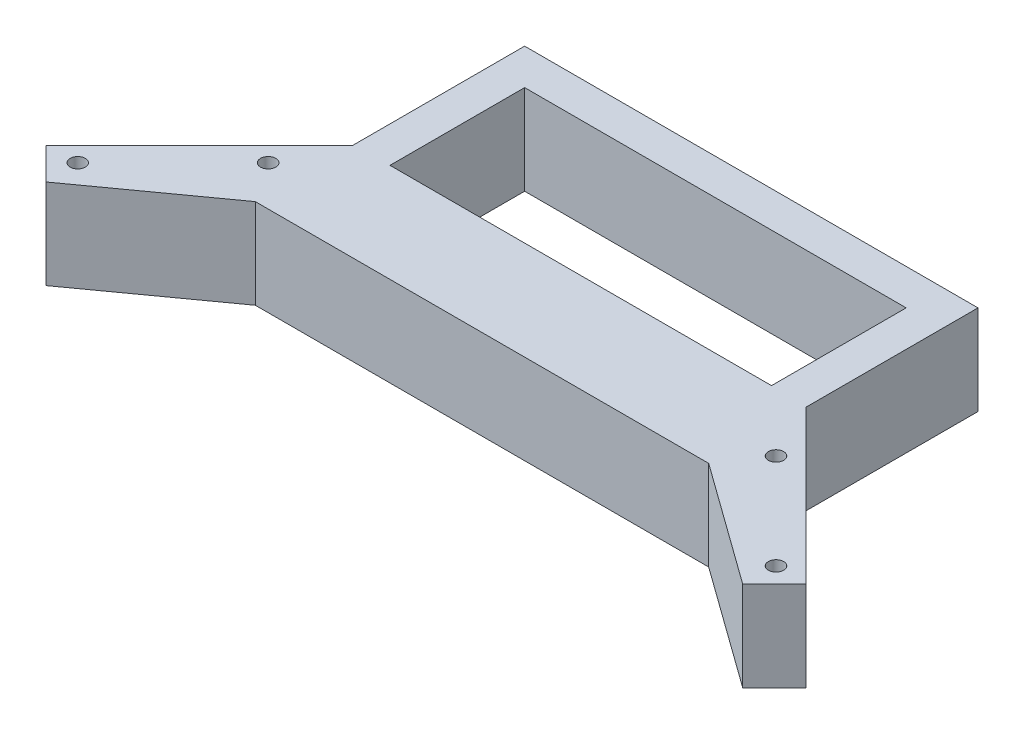
ISO-10303-21;
HEADER;
FILE_DESCRIPTION(('STEP AP214'),'2;1');
FILE_NAME('part.step','',(''),(''),'','','');
FILE_SCHEMA(('AUTOMOTIVE_DESIGN { 1 0 10303 214 1 1 1 1 }'));
ENDSEC;
DATA;
#1=APPLICATION_CONTEXT('core data for automotive mechanical design processes');
#2=APPLICATION_PROTOCOL_DEFINITION('international standard','automotive_design',2000,#1);
#3=PRODUCT_CONTEXT('',#1,'mechanical');
#4=PRODUCT('Part','Part','',(#3));
#5=PRODUCT_RELATED_PRODUCT_CATEGORY('part','',(#4));
#6=PRODUCT_DEFINITION_FORMATION('','',#4);
#7=PRODUCT_DEFINITION_CONTEXT('part definition',#1,'design');
#8=PRODUCT_DEFINITION('design','',#6,#7);
#9=PRODUCT_DEFINITION_SHAPE('','',#8);
#10=(LENGTH_UNIT() NAMED_UNIT(*) SI_UNIT(.MILLI.,.METRE.));
#11=(NAMED_UNIT(*) PLANE_ANGLE_UNIT() SI_UNIT($,.RADIAN.));
#12=(NAMED_UNIT(*) SI_UNIT($,.STERADIAN.) SOLID_ANGLE_UNIT());
#13=UNCERTAINTY_MEASURE_WITH_UNIT(LENGTH_MEASURE(1.E-05),#10,'distance_accuracy_value','');
#14=(GEOMETRIC_REPRESENTATION_CONTEXT(3) GLOBAL_UNCERTAINTY_ASSIGNED_CONTEXT((#13)) GLOBAL_UNIT_ASSIGNED_CONTEXT((#10,
#11,#12)) REPRESENTATION_CONTEXT('',''));
#15=CARTESIAN_POINT('',(0.,0.,0.));
#16=DIRECTION('',(0.,0.,1.));
#17=DIRECTION('',(1.,0.,0.));
#18=AXIS2_PLACEMENT_3D('',#15,#16,#17);
#19=CARTESIAN_POINT('',(-86.7629453922952,25.4,86.7629453922953));
#20=DIRECTION('',(0.707106781186547,0.,-0.707106781186548));
#21=DIRECTION('',(-0.707106781186548,0.,-0.707106781186547));
#22=AXIS2_PLACEMENT_3D('',#19,#20,#21);
#23=PLANE('',#22);
#24=DIRECTION('',(0.707106781186548,0.,0.707106781186547));
#25=VECTOR('',#24,1.);
#26=CARTESIAN_POINT('',(-86.7629453922952,0.,86.7629453922953));
#27=LINE('',#26,#25);
#28=CARTESIAN_POINT('',(-107.547547305924,0.,65.9783434786663));
#29=VERTEX_POINT('',#28);
#30=CARTESIAN_POINT('',(-98.567291184855,0.,74.9585995997355));
#31=VERTEX_POINT('',#30);
#32=EDGE_CURVE('E202',#29,#31,#27,.T.);
#33=ORIENTED_EDGE('',*,*,#32,.T.);
#34=DIRECTION('',(0.,-1.,0.));
#35=VECTOR('',#34,1.);
#36=CARTESIAN_POINT('',(-98.567291184855,25.4,74.9585995997355));
#37=LINE('',#36,#35);
#38=CARTESIAN_POINT('',(-98.567291184855,25.4,74.9585995997355));
#39=VERTEX_POINT('',#38);
#40=EDGE_CURVE('E11',#39,#31,#37,.T.);
#41=ORIENTED_EDGE('',*,*,#40,.F.);
#42=DIRECTION('',(0.707106781186548,0.,0.707106781186547));
#43=VECTOR('',#42,1.);
#44=CARTESIAN_POINT('',(-86.7629453922952,25.4,86.7629453922953));
#45=LINE('',#44,#43);
#46=CARTESIAN_POINT('',(-107.547547305924,25.4,65.9783434786663));
#47=VERTEX_POINT('',#46);
#48=EDGE_CURVE('E367',#47,#39,#45,.T.);
#49=ORIENTED_EDGE('',*,*,#48,.F.);
#50=DIRECTION('',(0.,-1.,0.));
#51=VECTOR('',#50,1.);
#52=CARTESIAN_POINT('',(-107.547547305924,25.4,65.9783434786663));
#53=LINE('',#52,#51);
#54=EDGE_CURVE('E235',#47,#29,#53,.T.);
#55=ORIENTED_EDGE('',*,*,#54,.T.);
#56=EDGE_LOOP('',(#33,#41,#49,#55));
#57=FACE_BOUND('',#56,.T.);
#58=ADVANCED_FACE('F38',(#57),#23,.F.);
#59=CARTESIAN_POINT('',(1.88892959468487,25.4,2.62326466837729));
#60=DIRECTION('',(-0.584341200542991,0.,-0.811508078424347));
#61=DIRECTION('',(-0.811508078424347,0.,0.584341200542991));
#62=AXIS2_PLACEMENT_3D('',#59,#60,#61);
#63=PLANE('',#62);
#64=DIRECTION('',(0.811508078424347,0.,-0.584341200542991));
#65=VECTOR('',#64,1.);
#66=CARTESIAN_POINT('',(1.88892959468487,0.,2.62326466837729));
#67=LINE('',#66,#65);
#68=CARTESIAN_POINT('',(-64.135,0.,50.165));
#69=VERTEX_POINT('',#68);
#70=EDGE_CURVE('E205',#31,#69,#67,.T.);
#71=ORIENTED_EDGE('',*,*,#70,.T.);
#72=DIRECTION('',(0.,-1.,0.));
#73=VECTOR('',#72,1.);
#74=CARTESIAN_POINT('',(-64.135,25.4,50.165));
#75=LINE('',#74,#73);
#76=CARTESIAN_POINT('',(-64.135,25.4,50.165));
#77=VERTEX_POINT('',#76);
#78=EDGE_CURVE('E48',#77,#69,#75,.T.);
#79=ORIENTED_EDGE('',*,*,#78,.F.);
#80=DIRECTION('',(0.811508078424347,0.,-0.584341200542991));
#81=VECTOR('',#80,1.);
#82=CARTESIAN_POINT('',(1.88892959468487,25.4,2.62326466837729));
#83=LINE('',#82,#81);
#84=EDGE_CURVE('E359',#39,#77,#83,.T.);
#85=ORIENTED_EDGE('',*,*,#84,.F.);
#86=ORIENTED_EDGE('',*,*,#40,.T.);
#87=EDGE_LOOP('',(#71,#79,#85,#86));
#88=FACE_BOUND('',#87,.T.);
#89=ADVANCED_FACE('F283',(#88),#63,.F.);
#90=CARTESIAN_POINT('',(0.,25.4,50.165));
#91=DIRECTION('',(0.,0.,-1.));
#92=DIRECTION('',(-1.,0.,0.));
#93=AXIS2_PLACEMENT_3D('',#90,#91,#92);
#94=PLANE('',#93);
#95=DIRECTION('',(1.,0.,0.));
#96=VECTOR('',#95,1.);
#97=CARTESIAN_POINT('',(0.,0.,50.165));
#98=LINE('',#97,#96);
#99=CARTESIAN_POINT('',(64.135,0.,50.165));
#100=VERTEX_POINT('',#99);
#101=EDGE_CURVE('E207',#69,#100,#98,.T.);
#102=ORIENTED_EDGE('',*,*,#101,.T.);
#103=DIRECTION('',(0.,-1.,0.));
#104=VECTOR('',#103,1.);
#105=CARTESIAN_POINT('',(64.135,25.4,50.165));
#106=LINE('',#105,#104);
#107=CARTESIAN_POINT('',(64.135,25.4,50.165));
#108=VERTEX_POINT('',#107);
#109=EDGE_CURVE('E245',#108,#100,#106,.T.);
#110=ORIENTED_EDGE('',*,*,#109,.F.);
#111=DIRECTION('',(1.,0.,0.));
#112=VECTOR('',#111,1.);
#113=CARTESIAN_POINT('',(0.,25.4,50.165));
#114=LINE('',#113,#112);
#115=EDGE_CURVE('E356',#77,#108,#114,.T.);
#116=ORIENTED_EDGE('',*,*,#115,.F.);
#117=ORIENTED_EDGE('',*,*,#78,.T.);
#118=EDGE_LOOP('',(#102,#110,#116,#117));
#119=FACE_BOUND('',#118,.T.);
#120=ADVANCED_FACE('F289',(#119),#94,.F.);
#121=CARTESIAN_POINT('',(-1.88892959468489,25.4,2.62326466837733));
#122=DIRECTION('',(-0.58434120054299,0.,0.811508078424347));
#123=DIRECTION('',(0.811508078424348,0.,0.58434120054299));
#124=AXIS2_PLACEMENT_3D('',#121,#122,#123);
#125=PLANE('',#124);
#126=DIRECTION('',(-0.811508078424347,0.,-0.58434120054299));
#127=VECTOR('',#126,1.);
#128=CARTESIAN_POINT('',(-1.88892959468489,0.,2.62326466837733));
#129=LINE('',#128,#127);
#130=CARTESIAN_POINT('',(98.567291184855,0.,74.9585995997355));
#131=VERTEX_POINT('',#130);
#132=EDGE_CURVE('E210',#131,#100,#129,.T.);
#133=ORIENTED_EDGE('',*,*,#132,.F.);
#134=DIRECTION('',(0.,-1.,0.));
#135=VECTOR('',#134,1.);
#136=CARTESIAN_POINT('',(98.567291184855,25.4,74.9585995997355));
#137=LINE('',#136,#135);
#138=CARTESIAN_POINT('',(98.567291184855,25.4,74.9585995997355));
#139=VERTEX_POINT('',#138);
#140=EDGE_CURVE('E243',#139,#131,#137,.T.);
#141=ORIENTED_EDGE('',*,*,#140,.F.);
#142=DIRECTION('',(-0.811508078424347,0.,-0.58434120054299));
#143=VECTOR('',#142,1.);
#144=CARTESIAN_POINT('',(-1.88892959468489,25.4,2.62326466837733));
#145=LINE('',#144,#143);
#146=EDGE_CURVE('E352',#139,#108,#145,.T.);
#147=ORIENTED_EDGE('',*,*,#146,.T.);
#148=ORIENTED_EDGE('',*,*,#109,.T.);
#149=EDGE_LOOP('',(#133,#141,#147,#148));
#150=FACE_BOUND('',#149,.T.);
#151=ADVANCED_FACE('F333',(#150),#125,.T.);
#152=CARTESIAN_POINT('',(86.7629453922954,25.4,86.7629453922952));
#153=DIRECTION('',(0.707106781186548,0.,0.707106781186546));
#154=DIRECTION('',(0.707106781186547,0.,-0.707106781186549));
#155=AXIS2_PLACEMENT_3D('',#152,#153,#154);
#156=PLANE('',#155);
#157=DIRECTION('',(-0.707106781186546,0.,0.707106781186549));
#158=VECTOR('',#157,1.);
#159=CARTESIAN_POINT('',(86.7629453922954,0.,86.7629453922952));
#160=LINE('',#159,#158);
#161=CARTESIAN_POINT('',(107.547547305924,0.,65.9783434786663));
#162=VERTEX_POINT('',#161);
#163=EDGE_CURVE('E213',#162,#131,#160,.T.);
#164=ORIENTED_EDGE('',*,*,#163,.F.);
#165=DIRECTION('',(0.,-1.,0.));
#166=VECTOR('',#165,1.);
#167=CARTESIAN_POINT('',(107.547547305924,25.4,65.9783434786663));
#168=LINE('',#167,#166);
#169=CARTESIAN_POINT('',(107.547547305924,25.4,65.9783434786663));
#170=VERTEX_POINT('',#169);
#171=EDGE_CURVE('E241',#170,#162,#168,.T.);
#172=ORIENTED_EDGE('',*,*,#171,.F.);
#173=DIRECTION('',(-0.707106781186546,0.,0.707106781186549));
#174=VECTOR('',#173,1.);
#175=CARTESIAN_POINT('',(86.7629453922954,25.4,86.7629453922952));
#176=LINE('',#175,#174);
#177=EDGE_CURVE('E355',#170,#139,#176,.T.);
#178=ORIENTED_EDGE('',*,*,#177,.T.);
#179=ORIENTED_EDGE('',*,*,#140,.T.);
#180=EDGE_LOOP('',(#164,#172,#178,#179));
#181=FACE_BOUND('',#180,.T.);
#182=ADVANCED_FACE('F329',(#181),#156,.T.);
#183=CARTESIAN_POINT('',(20.7846019136289,25.4,-20.7846019136289));
#184=DIRECTION('',(0.707106781186548,0.,-0.707106781186548));
#185=DIRECTION('',(-0.707106781186548,0.,-0.707106781186548));
#186=AXIS2_PLACEMENT_3D('',#183,#184,#185);
#187=PLANE('',#186);
#188=DIRECTION('',(0.707106781186548,0.,0.707106781186548));
#189=VECTOR('',#188,1.);
#190=CARTESIAN_POINT('',(20.7846019136289,0.,-20.7846019136289));
#191=LINE('',#190,#189);
#192=CARTESIAN_POINT('',(64.135,0.,22.5657961727422));
#193=VERTEX_POINT('',#192);
#194=EDGE_CURVE('E216',#193,#162,#191,.T.);
#195=ORIENTED_EDGE('',*,*,#194,.F.);
#196=DIRECTION('',(0.,-1.,0.));
#197=VECTOR('',#196,1.);
#198=CARTESIAN_POINT('',(64.135,25.4,22.5657961727422));
#199=LINE('',#198,#197);
#200=CARTESIAN_POINT('',(64.135,25.4,22.5657961727422));
#201=VERTEX_POINT('',#200);
#202=EDGE_CURVE('E239',#201,#193,#199,.T.);
#203=ORIENTED_EDGE('',*,*,#202,.F.);
#204=DIRECTION('',(0.707106781186548,0.,0.707106781186548));
#205=VECTOR('',#204,1.);
#206=CARTESIAN_POINT('',(20.7846019136289,25.4,-20.7846019136289));
#207=LINE('',#206,#205);
#208=EDGE_CURVE('E172',#201,#170,#207,.T.);
#209=ORIENTED_EDGE('',*,*,#208,.T.);
#210=ORIENTED_EDGE('',*,*,#171,.T.);
#211=EDGE_LOOP('',(#195,#203,#209,#210));
#212=FACE_BOUND('',#211,.T.);
#213=ADVANCED_FACE('F325',(#212),#187,.T.);
#214=CARTESIAN_POINT('',(64.135,25.4,0.));
#215=DIRECTION('',(1.,0.,0.));
#216=DIRECTION('',(0.,0.,-1.));
#217=AXIS2_PLACEMENT_3D('',#214,#215,#216);
#218=PLANE('',#217);
#219=DIRECTION('',(0.,0.,1.));
#220=VECTOR('',#219,1.);
#221=CARTESIAN_POINT('',(64.135,0.,0.));
#222=LINE('',#221,#220);
#223=CARTESIAN_POINT('',(64.135,0.,-26.035));
#224=VERTEX_POINT('',#223);
#225=EDGE_CURVE('E219',#224,#193,#222,.T.);
#226=ORIENTED_EDGE('',*,*,#225,.F.);
#227=DIRECTION('',(0.,-1.,0.));
#228=VECTOR('',#227,1.);
#229=CARTESIAN_POINT('',(64.135,25.4,-26.035));
#230=LINE('',#229,#228);
#231=CARTESIAN_POINT('',(64.135,25.4,-26.035));
#232=VERTEX_POINT('',#231);
#233=EDGE_CURVE('E159',#232,#224,#230,.T.);
#234=ORIENTED_EDGE('',*,*,#233,.F.);
#235=DIRECTION('',(0.,0.,1.));
#236=VECTOR('',#235,1.);
#237=CARTESIAN_POINT('',(64.135,25.4,0.));
#238=LINE('',#237,#236);
#239=EDGE_CURVE('E170',#232,#201,#238,.T.);
#240=ORIENTED_EDGE('',*,*,#239,.T.);
#241=ORIENTED_EDGE('',*,*,#202,.T.);
#242=EDGE_LOOP('',(#226,#234,#240,#241));
#243=FACE_BOUND('',#242,.T.);
#244=ADVANCED_FACE('F322',(#243),#218,.T.);
#245=CARTESIAN_POINT('',(0.,25.4,-26.035));
#246=DIRECTION('',(0.,0.,-1.));
#247=DIRECTION('',(-1.,0.,0.));
#248=AXIS2_PLACEMENT_3D('',#245,#246,#247);
#249=PLANE('',#248);
#250=DIRECTION('',(1.,0.,0.));
#251=VECTOR('',#250,1.);
#252=CARTESIAN_POINT('',(0.,0.,-26.035));
#253=LINE('',#252,#251);
#254=CARTESIAN_POINT('',(-64.135,0.,-26.035));
#255=VERTEX_POINT('',#254);
#256=EDGE_CURVE('E158',#255,#224,#253,.T.);
#257=ORIENTED_EDGE('',*,*,#256,.F.);
#258=DIRECTION('',(0.,-1.,0.));
#259=VECTOR('',#258,1.);
#260=CARTESIAN_POINT('',(-64.135,25.4,-26.035));
#261=LINE('',#260,#259);
#262=CARTESIAN_POINT('',(-64.135,25.4,-26.035));
#263=VERTEX_POINT('',#262);
#264=EDGE_CURVE('E152',#263,#255,#261,.T.);
#265=ORIENTED_EDGE('',*,*,#264,.F.);
#266=DIRECTION('',(1.,0.,0.));
#267=VECTOR('',#266,1.);
#268=CARTESIAN_POINT('',(0.,25.4,-26.035));
#269=LINE('',#268,#267);
#270=EDGE_CURVE('E156',#263,#232,#269,.T.);
#271=ORIENTED_EDGE('',*,*,#270,.T.);
#272=ORIENTED_EDGE('',*,*,#233,.T.);
#273=EDGE_LOOP('',(#257,#265,#271,#272));
#274=FACE_BOUND('',#273,.T.);
#275=ADVANCED_FACE('F154',(#274),#249,.T.);
#276=CARTESIAN_POINT('',(-64.135,25.4,0.));
#277=DIRECTION('',(1.,0.,0.));
#278=DIRECTION('',(0.,0.,-1.));
#279=AXIS2_PLACEMENT_3D('',#276,#277,#278);
#280=PLANE('',#279);
#281=DIRECTION('',(0.,0.,1.));
#282=VECTOR('',#281,1.);
#283=CARTESIAN_POINT('',(-64.135,0.,0.));
#284=LINE('',#283,#282);
#285=CARTESIAN_POINT('',(-64.135,0.,22.5657961727421));
#286=VERTEX_POINT('',#285);
#287=EDGE_CURVE('E103',#255,#286,#284,.T.);
#288=ORIENTED_EDGE('',*,*,#287,.T.);
#289=DIRECTION('',(0.,-1.,0.));
#290=VECTOR('',#289,1.);
#291=CARTESIAN_POINT('',(-64.135,25.4,22.5657961727421));
#292=LINE('',#291,#290);
#293=CARTESIAN_POINT('',(-64.135,25.4,22.5657961727421));
#294=VERTEX_POINT('',#293);
#295=EDGE_CURVE('E160',#294,#286,#292,.T.);
#296=ORIENTED_EDGE('',*,*,#295,.F.);
#297=DIRECTION('',(0.,0.,1.));
#298=VECTOR('',#297,1.);
#299=CARTESIAN_POINT('',(-64.135,25.4,0.));
#300=LINE('',#299,#298);
#301=EDGE_CURVE('E162',#263,#294,#300,.T.);
#302=ORIENTED_EDGE('',*,*,#301,.F.);
#303=ORIENTED_EDGE('',*,*,#264,.T.);
#304=EDGE_LOOP('',(#288,#296,#302,#303));
#305=FACE_BOUND('',#304,.T.);
#306=ADVANCED_FACE('F163',(#305),#280,.F.);
#307=CARTESIAN_POINT('',(0.,25.4,-15.875));
#308=DIRECTION('',(0.,0.,-1.));
#309=DIRECTION('',(-1.,0.,0.));
#310=AXIS2_PLACEMENT_3D('',#307,#308,#309);
#311=PLANE('',#310);
#312=DIRECTION('',(1.,0.,0.));
#313=VECTOR('',#312,1.);
#314=CARTESIAN_POINT('',(0.,0.,-15.875));
#315=LINE('',#314,#313);
#316=CARTESIAN_POINT('',(-53.975,0.,-15.875));
#317=VERTEX_POINT('',#316);
#318=CARTESIAN_POINT('',(53.975,0.,-15.875));
#319=VERTEX_POINT('',#318);
#320=EDGE_CURVE('E187',#317,#319,#315,.T.);
#321=ORIENTED_EDGE('',*,*,#320,.T.);
#322=DIRECTION('',(0.,-1.,0.));
#323=VECTOR('',#322,1.);
#324=CARTESIAN_POINT('',(53.975,25.4,-15.875));
#325=LINE('',#324,#323);
#326=CARTESIAN_POINT('',(53.975,25.4,-15.875));
#327=VERTEX_POINT('',#326);
#328=EDGE_CURVE('E42',#327,#319,#325,.T.);
#329=ORIENTED_EDGE('',*,*,#328,.F.);
#330=DIRECTION('',(1.,0.,0.));
#331=VECTOR('',#330,1.);
#332=CARTESIAN_POINT('',(0.,25.4,-15.875));
#333=LINE('',#332,#331);
#334=CARTESIAN_POINT('',(-53.975,25.4,-15.875));
#335=VERTEX_POINT('',#334);
#336=EDGE_CURVE('E234',#335,#327,#333,.T.);
#337=ORIENTED_EDGE('',*,*,#336,.F.);
#338=DIRECTION('',(0.,-1.,0.));
#339=VECTOR('',#338,1.);
#340=CARTESIAN_POINT('',(-53.975,25.4,-15.875));
#341=LINE('',#340,#339);
#342=EDGE_CURVE('E186',#335,#317,#341,.T.);
#343=ORIENTED_EDGE('',*,*,#342,.T.);
#344=EDGE_LOOP('',(#321,#329,#337,#343));
#345=FACE_BOUND('',#344,.T.);
#346=ADVANCED_FACE('F40',(#345),#311,.F.);
#347=CARTESIAN_POINT('',(53.975,25.4,0.));
#348=DIRECTION('',(1.,0.,0.));
#349=DIRECTION('',(0.,0.,-1.));
#350=AXIS2_PLACEMENT_3D('',#347,#348,#349);
#351=PLANE('',#350);
#352=DIRECTION('',(0.,0.,1.));
#353=VECTOR('',#352,1.);
#354=CARTESIAN_POINT('',(53.975,0.,0.));
#355=LINE('',#354,#353);
#356=CARTESIAN_POINT('',(53.975,0.,22.225));
#357=VERTEX_POINT('',#356);
#358=EDGE_CURVE('E190',#319,#357,#355,.T.);
#359=ORIENTED_EDGE('',*,*,#358,.T.);
#360=DIRECTION('',(0.,-1.,0.));
#361=VECTOR('',#360,1.);
#362=CARTESIAN_POINT('',(53.975,25.4,22.225));
#363=LINE('',#362,#361);
#364=CARTESIAN_POINT('',(53.975,25.4,22.225));
#365=VERTEX_POINT('',#364);
#366=EDGE_CURVE('E251',#365,#357,#363,.T.);
#367=ORIENTED_EDGE('',*,*,#366,.F.);
#368=DIRECTION('',(0.,0.,1.));
#369=VECTOR('',#368,1.);
#370=CARTESIAN_POINT('',(53.975,25.4,0.));
#371=LINE('',#370,#369);
#372=EDGE_CURVE('E118',#327,#365,#371,.T.);
#373=ORIENTED_EDGE('',*,*,#372,.F.);
#374=ORIENTED_EDGE('',*,*,#328,.T.);
#375=EDGE_LOOP('',(#359,#367,#373,#374));
#376=FACE_BOUND('',#375,.T.);
#377=ADVANCED_FACE('F256',(#376),#351,.F.);
#378=CARTESIAN_POINT('',(0.,25.4,22.225));
#379=DIRECTION('',(0.,0.,-1.));
#380=DIRECTION('',(-1.,0.,0.));
#381=AXIS2_PLACEMENT_3D('',#378,#379,#380);
#382=PLANE('',#381);
#383=DIRECTION('',(1.,0.,0.));
#384=VECTOR('',#383,1.);
#385=CARTESIAN_POINT('',(0.,0.,22.225));
#386=LINE('',#385,#384);
#387=CARTESIAN_POINT('',(-53.975,0.,22.225));
#388=VERTEX_POINT('',#387);
#389=EDGE_CURVE('E193',#388,#357,#386,.T.);
#390=ORIENTED_EDGE('',*,*,#389,.F.);
#391=DIRECTION('',(0.,-1.,0.));
#392=VECTOR('',#391,1.);
#393=CARTESIAN_POINT('',(-53.975,25.4,22.225));
#394=LINE('',#393,#392);
#395=CARTESIAN_POINT('',(-53.975,25.4,22.225));
#396=VERTEX_POINT('',#395);
#397=EDGE_CURVE('E250',#396,#388,#394,.T.);
#398=ORIENTED_EDGE('',*,*,#397,.F.);
#399=DIRECTION('',(1.,0.,0.));
#400=VECTOR('',#399,1.);
#401=CARTESIAN_POINT('',(0.,25.4,22.225));
#402=LINE('',#401,#400);
#403=EDGE_CURVE('E374',#396,#365,#402,.T.);
#404=ORIENTED_EDGE('',*,*,#403,.T.);
#405=ORIENTED_EDGE('',*,*,#366,.T.);
#406=EDGE_LOOP('',(#390,#398,#404,#405));
#407=FACE_BOUND('',#406,.T.);
#408=ADVANCED_FACE('F270',(#407),#382,.T.);
#409=CARTESIAN_POINT('',(98.7828173317607,25.4,65.7628173317607));
#410=DIRECTION('',(0.,-1.,0.));
#411=DIRECTION('',(0.,0.,-1.));
#412=AXIS2_PLACEMENT_3D('',#409,#410,#411);
#413=CYLINDRICAL_SURFACE('',#412,2.15899999999999);
#414=CARTESIAN_POINT('',(98.7828173317607,25.4,65.7628173317607));
#415=DIRECTION('',(0.,1.,0.));
#416=DIRECTION('',(0.,0.,1.));
#417=AXIS2_PLACEMENT_3D('',#414,#415,#416);
#418=CIRCLE('',#417,2.15899999999999);
#419=CARTESIAN_POINT('',(98.7828173317607,25.4,67.9218173317607));
#420=VERTEX_POINT('',#419);
#421=EDGE_CURVE('E180',#420,#420,#418,.T.);
#422=ORIENTED_EDGE('',*,*,#421,.T.);
#423=EDGE_LOOP('',(#422));
#424=FACE_BOUND('',#423,.T.);
#425=CARTESIAN_POINT('',(98.7828173317607,0.,65.7628173317607));
#426=DIRECTION('',(0.,1.,0.));
#427=DIRECTION('',(0.,0.,1.));
#428=AXIS2_PLACEMENT_3D('',#425,#426,#427);
#429=CIRCLE('',#428,2.15899999999999);
#430=CARTESIAN_POINT('',(98.7828173317607,0.,67.9218173317607));
#431=VERTEX_POINT('',#430);
#432=EDGE_CURVE('E228',#431,#431,#429,.T.);
#433=ORIENTED_EDGE('',*,*,#432,.F.);
#434=EDGE_LOOP('',(#433));
#435=FACE_BOUND('',#434,.T.);
#436=ADVANCED_FACE('F272',(#424,#435),#413,.F.);
#437=CARTESIAN_POINT('',(71.8420489685532,25.4,38.8220489685532));
#438=DIRECTION('',(0.,-1.,0.));
#439=DIRECTION('',(0.,0.,-1.));
#440=AXIS2_PLACEMENT_3D('',#437,#438,#439);
#441=CYLINDRICAL_SURFACE('',#440,2.15899999999999);
#442=CARTESIAN_POINT('',(71.8420489685532,25.4,38.8220489685532));
#443=DIRECTION('',(0.,1.,0.));
#444=DIRECTION('',(0.,0.,1.));
#445=AXIS2_PLACEMENT_3D('',#442,#443,#444);
#446=CIRCLE('',#445,2.15899999999999);
#447=CARTESIAN_POINT('',(71.8420489685532,25.4,40.9810489685532));
#448=VERTEX_POINT('',#447);
#449=EDGE_CURVE('E177',#448,#448,#446,.T.);
#450=ORIENTED_EDGE('',*,*,#449,.T.);
#451=EDGE_LOOP('',(#450));
#452=FACE_BOUND('',#451,.T.);
#453=CARTESIAN_POINT('',(71.8420489685532,0.,38.8220489685532));
#454=DIRECTION('',(0.,1.,0.));
#455=DIRECTION('',(0.,0.,1.));
#456=AXIS2_PLACEMENT_3D('',#453,#454,#455);
#457=CIRCLE('',#456,2.15899999999999);
#458=CARTESIAN_POINT('',(71.8420489685532,0.,40.9810489685532));
#459=VERTEX_POINT('',#458);
#460=EDGE_CURVE('E225',#459,#459,#457,.T.);
#461=ORIENTED_EDGE('',*,*,#460,.F.);
#462=EDGE_LOOP('',(#461));
#463=FACE_BOUND('',#462,.T.);
#464=ADVANCED_FACE('F278',(#452,#463),#441,.F.);
#465=CARTESIAN_POINT('',(-20.784601913629,25.4,-20.7846019136289));
#466=DIRECTION('',(0.707106781186548,0.,0.707106781186547));
#467=DIRECTION('',(0.707106781186547,0.,-0.707106781186548));
#468=AXIS2_PLACEMENT_3D('',#465,#466,#467);
#469=PLANE('',#468);
#470=DIRECTION('',(-0.707106781186547,0.,0.707106781186548));
#471=VECTOR('',#470,1.);
#472=CARTESIAN_POINT('',(-20.784601913629,0.,-20.7846019136289));
#473=LINE('',#472,#471);
#474=EDGE_CURVE('E109',#286,#29,#473,.T.);
#475=ORIENTED_EDGE('',*,*,#474,.T.);
#476=ORIENTED_EDGE('',*,*,#54,.F.);
#477=DIRECTION('',(-0.707106781186547,0.,0.707106781186548));
#478=VECTOR('',#477,1.);
#479=CARTESIAN_POINT('',(-20.784601913629,25.4,-20.7846019136289));
#480=LINE('',#479,#478);
#481=EDGE_CURVE('E57',#294,#47,#480,.T.);
#482=ORIENTED_EDGE('',*,*,#481,.F.);
#483=ORIENTED_EDGE('',*,*,#295,.T.);
#484=EDGE_LOOP('',(#475,#476,#482,#483));
#485=FACE_BOUND('',#484,.T.);
#486=ADVANCED_FACE('F296',(#485),#469,.F.);
#487=CARTESIAN_POINT('',(-71.8420489685532,25.4,38.8220489685532));
#488=DIRECTION('',(0.,-1.,0.));
#489=DIRECTION('',(0.,0.,-1.));
#490=AXIS2_PLACEMENT_3D('',#487,#488,#489);
#491=CYLINDRICAL_SURFACE('',#490,2.15899999999999);
#492=CARTESIAN_POINT('',(-71.8420489685532,25.4,38.8220489685532));
#493=DIRECTION('',(0.,1.,0.));
#494=DIRECTION('',(0.,0.,1.));
#495=AXIS2_PLACEMENT_3D('',#492,#493,#494);
#496=CIRCLE('',#495,2.15899999999999);
#497=CARTESIAN_POINT('',(-71.8420489685532,25.4,40.9810489685532));
#498=VERTEX_POINT('',#497);
#499=EDGE_CURVE('E368',#498,#498,#496,.T.);
#500=ORIENTED_EDGE('',*,*,#499,.T.);
#501=EDGE_LOOP('',(#500));
#502=FACE_BOUND('',#501,.T.);
#503=CARTESIAN_POINT('',(-71.8420489685532,0.,38.8220489685532));
#504=DIRECTION('',(0.,1.,0.));
#505=DIRECTION('',(0.,0.,1.));
#506=AXIS2_PLACEMENT_3D('',#503,#504,#505);
#507=CIRCLE('',#506,2.15899999999999);
#508=CARTESIAN_POINT('',(-71.8420489685532,0.,40.9810489685532));
#509=VERTEX_POINT('',#508);
#510=EDGE_CURVE('E199',#509,#509,#507,.T.);
#511=ORIENTED_EDGE('',*,*,#510,.F.);
#512=EDGE_LOOP('',(#511));
#513=FACE_BOUND('',#512,.T.);
#514=ADVANCED_FACE('F294',(#502,#513),#491,.F.);
#515=CARTESIAN_POINT('',(-53.975,25.4,0.));
#516=DIRECTION('',(1.,0.,0.));
#517=DIRECTION('',(0.,0.,-1.));
#518=AXIS2_PLACEMENT_3D('',#515,#516,#517);
#519=PLANE('',#518);
#520=DIRECTION('',(0.,0.,1.));
#521=VECTOR('',#520,1.);
#522=CARTESIAN_POINT('',(-53.975,0.,0.));
#523=LINE('',#522,#521);
#524=EDGE_CURVE('E196',#317,#388,#523,.T.);
#525=ORIENTED_EDGE('',*,*,#524,.F.);
#526=ORIENTED_EDGE('',*,*,#342,.F.);
#527=DIRECTION('',(0.,0.,1.));
#528=VECTOR('',#527,1.);
#529=CARTESIAN_POINT('',(-53.975,25.4,0.));
#530=LINE('',#529,#528);
#531=EDGE_CURVE('E268',#335,#396,#530,.T.);
#532=ORIENTED_EDGE('',*,*,#531,.T.);
#533=ORIENTED_EDGE('',*,*,#397,.T.);
#534=EDGE_LOOP('',(#525,#526,#532,#533));
#535=FACE_BOUND('',#534,.T.);
#536=ADVANCED_FACE('F265',(#535),#519,.T.);
#537=CARTESIAN_POINT('',(-98.7828173317607,25.4,65.7628173317607));
#538=DIRECTION('',(0.,-1.,0.));
#539=DIRECTION('',(0.,0.,-1.));
#540=AXIS2_PLACEMENT_3D('',#537,#538,#539);
#541=CYLINDRICAL_SURFACE('',#540,2.15899999999999);
#542=CARTESIAN_POINT('',(-98.7828173317607,25.4,65.7628173317607));
#543=DIRECTION('',(0.,1.,0.));
#544=DIRECTION('',(0.,0.,1.));
#545=AXIS2_PLACEMENT_3D('',#542,#543,#544);
#546=CIRCLE('',#545,2.15899999999999);
#547=CARTESIAN_POINT('',(-98.7828173317607,25.4,67.9218173317607));
#548=VERTEX_POINT('',#547);
#549=EDGE_CURVE('E183',#548,#548,#546,.T.);
#550=ORIENTED_EDGE('',*,*,#549,.T.);
#551=EDGE_LOOP('',(#550));
#552=FACE_BOUND('',#551,.T.);
#553=CARTESIAN_POINT('',(-98.7828173317607,0.,65.7628173317607));
#554=DIRECTION('',(0.,1.,0.));
#555=DIRECTION('',(0.,0.,1.));
#556=AXIS2_PLACEMENT_3D('',#553,#554,#555);
#557=CIRCLE('',#556,2.15899999999999);
#558=CARTESIAN_POINT('',(-98.7828173317607,0.,67.9218173317607));
#559=VERTEX_POINT('',#558);
#560=EDGE_CURVE('E231',#559,#559,#557,.T.);
#561=ORIENTED_EDGE('',*,*,#560,.F.);
#562=EDGE_LOOP('',(#561));
#563=FACE_BOUND('',#562,.T.);
#564=ADVANCED_FACE('F299',(#552,#563),#541,.F.);
#565=CARTESIAN_POINT('',(0.,25.4,0.));
#566=DIRECTION('',(0.,1.,0.));
#567=DIRECTION('',(0.,0.,1.));
#568=AXIS2_PLACEMENT_3D('',#565,#566,#567);
#569=PLANE('',#568);
#570=ORIENTED_EDGE('',*,*,#336,.T.);
#571=ORIENTED_EDGE('',*,*,#372,.T.);
#572=ORIENTED_EDGE('',*,*,#403,.F.);
#573=ORIENTED_EDGE('',*,*,#531,.F.);
#574=EDGE_LOOP('',(#570,#571,#572,#573));
#575=FACE_BOUND('',#574,.T.);
#576=ORIENTED_EDGE('',*,*,#499,.F.);
#577=EDGE_LOOP('',(#576));
#578=FACE_BOUND('',#577,.T.);
#579=ORIENTED_EDGE('',*,*,#48,.T.);
#580=ORIENTED_EDGE('',*,*,#84,.T.);
#581=ORIENTED_EDGE('',*,*,#115,.T.);
#582=ORIENTED_EDGE('',*,*,#146,.F.);
#583=ORIENTED_EDGE('',*,*,#177,.F.);
#584=ORIENTED_EDGE('',*,*,#208,.F.);
#585=ORIENTED_EDGE('',*,*,#239,.F.);
#586=ORIENTED_EDGE('',*,*,#270,.F.);
#587=ORIENTED_EDGE('',*,*,#301,.T.);
#588=ORIENTED_EDGE('',*,*,#481,.T.);
#589=EDGE_LOOP('',(#579,#580,#581,#582,#583,#584,#585,#586,#587,#588));
#590=FACE_BOUND('',#589,.T.);
#591=ORIENTED_EDGE('',*,*,#449,.F.);
#592=EDGE_LOOP('',(#591));
#593=FACE_BOUND('',#592,.T.);
#594=ORIENTED_EDGE('',*,*,#421,.F.);
#595=EDGE_LOOP('',(#594));
#596=FACE_BOUND('',#595,.T.);
#597=ORIENTED_EDGE('',*,*,#549,.F.);
#598=EDGE_LOOP('',(#597));
#599=FACE_BOUND('',#598,.T.);
#600=ADVANCED_FACE('F166',(#575,#578,#590,#593,#596,#599),#569,.T.);
#601=CARTESIAN_POINT('',(0.,0.,0.));
#602=DIRECTION('',(0.,1.,0.));
#603=DIRECTION('',(0.,0.,1.));
#604=AXIS2_PLACEMENT_3D('',#601,#602,#603);
#605=PLANE('',#604);
#606=ORIENTED_EDGE('',*,*,#320,.F.);
#607=ORIENTED_EDGE('',*,*,#524,.T.);
#608=ORIENTED_EDGE('',*,*,#389,.T.);
#609=ORIENTED_EDGE('',*,*,#358,.F.);
#610=EDGE_LOOP('',(#606,#607,#608,#609));
#611=FACE_BOUND('',#610,.T.);
#612=ORIENTED_EDGE('',*,*,#510,.T.);
#613=EDGE_LOOP('',(#612));
#614=FACE_BOUND('',#613,.T.);
#615=ORIENTED_EDGE('',*,*,#32,.F.);
#616=ORIENTED_EDGE('',*,*,#474,.F.);
#617=ORIENTED_EDGE('',*,*,#287,.F.);
#618=ORIENTED_EDGE('',*,*,#256,.T.);
#619=ORIENTED_EDGE('',*,*,#225,.T.);
#620=ORIENTED_EDGE('',*,*,#194,.T.);
#621=ORIENTED_EDGE('',*,*,#163,.T.);
#622=ORIENTED_EDGE('',*,*,#132,.T.);
#623=ORIENTED_EDGE('',*,*,#101,.F.);
#624=ORIENTED_EDGE('',*,*,#70,.F.);
#625=EDGE_LOOP('',(#615,#616,#617,#618,#619,#620,#621,#622,#623,#624));
#626=FACE_BOUND('',#625,.T.);
#627=ORIENTED_EDGE('',*,*,#460,.T.);
#628=EDGE_LOOP('',(#627));
#629=FACE_BOUND('',#628,.T.);
#630=ORIENTED_EDGE('',*,*,#432,.T.);
#631=EDGE_LOOP('',(#630));
#632=FACE_BOUND('',#631,.T.);
#633=ORIENTED_EDGE('',*,*,#560,.T.);
#634=EDGE_LOOP('',(#633));
#635=FACE_BOUND('',#634,.T.);
#636=ADVANCED_FACE('F262',(#611,#614,#626,#629,#632,#635),#605,.F.);
#637=CLOSED_SHELL('',(#58,#89,#120,#151,#182,#213,#244,#275,#306,#346,#377,#408,#436,#464,#486,
#514,#536,#564,#600,#636));
#638=MANIFOLD_SOLID_BREP('B2',#637);
#639=ADVANCED_BREP_SHAPE_REPRESENTATION('',(#18,#638),#14);
#640=SHAPE_DEFINITION_REPRESENTATION(#9,#639);
ENDSEC;
END-ISO-10303-21;
